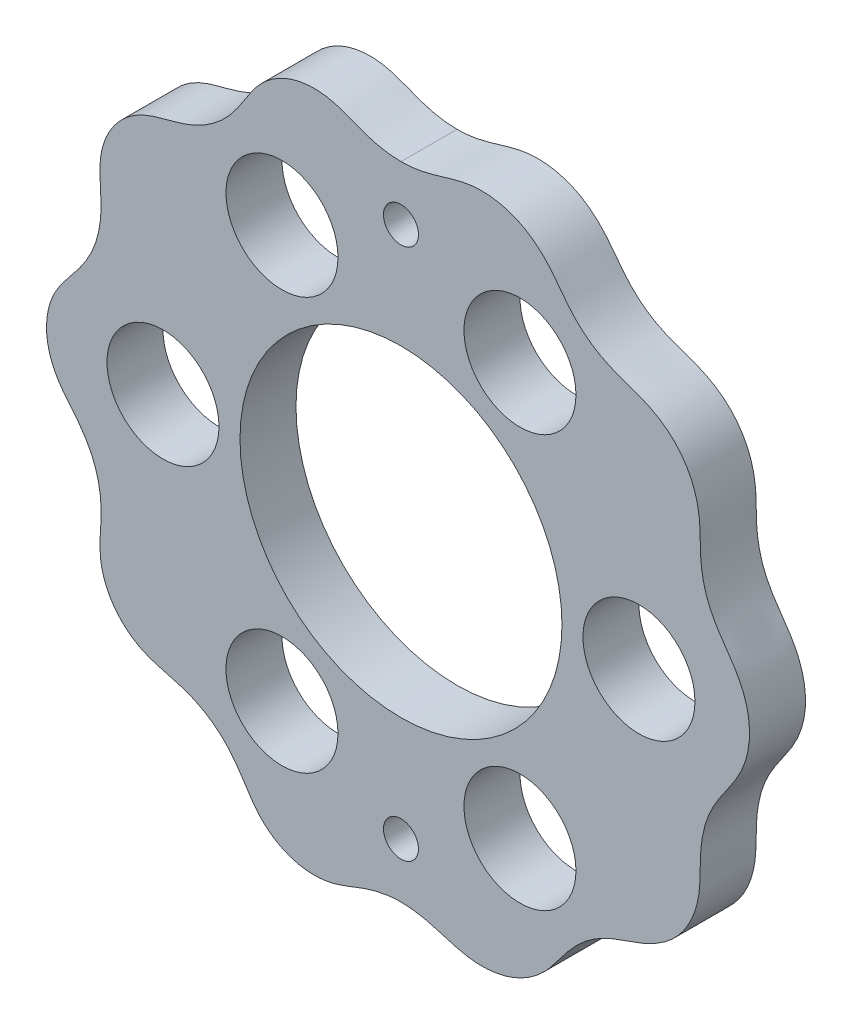
ISO-10303-21;
HEADER;
FILE_DESCRIPTION(('STEP AP214'),'2;1');
FILE_NAME('part.step','',(''),(''),'','','');
FILE_SCHEMA(('AUTOMOTIVE_DESIGN { 1 0 10303 214 1 1 1 1 }'));
ENDSEC;
DATA;
#1=APPLICATION_CONTEXT('core data for automotive mechanical design processes');
#2=APPLICATION_PROTOCOL_DEFINITION('international standard','automotive_design',2000,#1);
#3=PRODUCT_CONTEXT('',#1,'mechanical');
#4=PRODUCT('Part','Part','',(#3));
#5=PRODUCT_RELATED_PRODUCT_CATEGORY('part','',(#4));
#6=PRODUCT_DEFINITION_FORMATION('','',#4);
#7=PRODUCT_DEFINITION_CONTEXT('part definition',#1,'design');
#8=PRODUCT_DEFINITION('design','',#6,#7);
#9=PRODUCT_DEFINITION_SHAPE('','',#8);
#10=(LENGTH_UNIT() NAMED_UNIT(*) SI_UNIT(.MILLI.,.METRE.));
#11=(NAMED_UNIT(*) PLANE_ANGLE_UNIT() SI_UNIT($,.RADIAN.));
#12=(NAMED_UNIT(*) SI_UNIT($,.STERADIAN.) SOLID_ANGLE_UNIT());
#13=UNCERTAINTY_MEASURE_WITH_UNIT(LENGTH_MEASURE(1.E-05),#10,'distance_accuracy_value','');
#14=(GEOMETRIC_REPRESENTATION_CONTEXT(3) GLOBAL_UNCERTAINTY_ASSIGNED_CONTEXT((#13)) GLOBAL_UNIT_ASSIGNED_CONTEXT((#10,
#11,#12)) REPRESENTATION_CONTEXT('',''));
#15=CARTESIAN_POINT('',(0.,0.,0.));
#16=DIRECTION('',(0.,0.,1.));
#17=DIRECTION('',(1.,0.,0.));
#18=AXIS2_PLACEMENT_3D('',#15,#16,#17);
#19=CARTESIAN_POINT('',(0.,0.,4.));
#20=DIRECTION('',(0.,0.,1.));
#21=DIRECTION('',(1.,0.,0.));
#22=AXIS2_PLACEMENT_3D('',#19,#20,#21);
#23=PLANE('',#22);
#24=CARTESIAN_POINT('',(6.80687385689952E-08,22.9,4.));
#25=CARTESIAN_POINT('',(-0.849848245575323,22.899999421519,4.));
#26=CARTESIAN_POINT('',(-2.55799703086719,23.234494518274,4.));
#27=CARTESIAN_POINT('',(-4.84209897320977,24.3571470029628,4.));
#28=CARTESIAN_POINT('',(-7.38824943289522,24.4090318004474,4.));
#29=CARTESIAN_POINT('',(-9.2989625766548,23.4707300033717,4.));
#30=CARTESIAN_POINT('',(-10.4476099129223,22.2655269655052,4.));
#31=CARTESIAN_POINT('',(-11.1222996599059,21.2067402829562,4.));
#32=CARTESIAN_POINT('',(-11.8109485603763,20.1346897958365,4.));
#33=CARTESIAN_POINT('',(-12.9292093113298,18.8343042134774,4.));
#34=CARTESIAN_POINT('',(-14.3734940678994,17.867994898642,4.));
#35=CARTESIAN_POINT('',(-15.9902055685397,17.3091603310618,4.));
#36=CARTESIAN_POINT('',(-17.2240962787875,17.0202874716661,4.));
#37=CARTESIAN_POINT('',(-18.4122599863667,16.6333152815989,4.));
#38=CARTESIAN_POINT('',(-19.8401974179204,15.7732146910942,4.));
#39=CARTESIAN_POINT('',(-20.9023859706389,14.4467282823421,4.));
#40=CARTESIAN_POINT('',(-21.4305941193407,12.8657609067849,4.));
#41=CARTESIAN_POINT('',(-21.5384396494871,11.6220858465061,4.));
#42=CARTESIAN_POINT('',(-21.4395578627306,10.3668669478771,4.));
#43=CARTESIAN_POINT('',(-21.3781665530133,8.66414807055586,4.));
#44=CARTESIAN_POINT('',(-21.719833588447,6.96081431446029,4.));
#45=CARTESIAN_POINT('',(-22.5115323811958,5.43696216553692,4.));
#46=CARTESIAN_POINT('',(-23.2720433261361,4.40765566357071,4.));
#47=CARTESIAN_POINT('',(-24.1010226117925,3.45382079272216,4.));
#48=CARTESIAN_POINT('',(-25.0222606755398,2.0670338402279,4.));
#49=CARTESIAN_POINT('',(-25.5201681250728,-5.11647539657226E-08,4.));
#50=CARTESIAN_POINT('',(-25.022260643646,-2.06703393448226,4.));
#51=CARTESIAN_POINT('',(-24.1010225605347,-3.45382087422553,4.));
#52=CARTESIAN_POINT('',(-23.2720432731089,-4.40765574556851,4.));
#53=CARTESIAN_POINT('',(-22.5115323370295,-5.436962254891,4.));
#54=CARTESIAN_POINT('',(-21.7198335615532,-6.96081441318514,4.));
#55=CARTESIAN_POINT('',(-21.3781665475565,-8.66414817326333,4.));
#56=CARTESIAN_POINT('',(-21.43955787087,-10.366867048911,4.));
#57=CARTESIAN_POINT('',(-21.5384396524126,-11.6220859465092,4.));
#58=CARTESIAN_POINT('',(-21.4305941038811,-12.8657610053165,4.));
#59=CARTESIAN_POINT('',(-20.9023859310896,-14.4467283727275,4.));
#60=CARTESIAN_POINT('',(-19.8401973582201,-15.7732147654789,4.));
#61=CARTESIAN_POINT('',(-18.4122599136518,-16.6333153340259,4.));
#62=CARTESIAN_POINT('',(-17.2240962007482,-17.0202875096316,4.));
#63=CARTESIAN_POINT('',(-15.990205489842,-17.3091603719216,4.));
#64=CARTESIAN_POINT('',(-14.3734939938859,-17.8679949555753,4.));
#65=CARTESIAN_POINT('',(-12.9292092491784,-18.8343042887868,4.));
#66=CARTESIAN_POINT('',(-11.8109485132322,-20.1346898826596,4.));
#67=CARTESIAN_POINT('',(-11.1222996193085,-21.206740373664,4.));
#68=CARTESIAN_POINT('',(-10.4476098666809,-22.2655270497212,4.));
#69=CARTESIAN_POINT('',(-9.29896251077115,-23.470730072071,4.));
#70=CARTESIAN_POINT('',(-7.38824935040255,-24.4090318289951,4.));
#71=CARTESIAN_POINT('',(-4.84209890282732,-24.357147038307,4.));
#72=CARTESIAN_POINT('',(-2.55799696718396,-23.2344943482924,4.));
#73=CARTESIAN_POINT('',(-0.84984825840374,-22.8999997768332,4.));
#74=CARTESIAN_POINT('',(2.62595970309247E-08,-22.9,4.));
#75=B_SPLINE_CURVE_WITH_KNOTS('',3,(#24,#25,#26,#27,#28,#29,#30,#31,#32,#33,#34,#35,#36,#37,#38,
#39,#40,#41,#42,#43,#44,#45,#46,#47,#48,#49,#50,#51,#52,#53,#54,#55,#56,#57,#58,#59,#60,#61,#62,
#63,#64,#65,#66,#67,#68,#69,#70,#71,#72,#73,#74),.UNSPECIFIED.,.F.,.F.,(4,1,1,1,1,1,1,1,1,1,1,1,
1,1,1,1,1,1,1,1,1,1,1,1,1,1,1,1,1,1,1,1,1,1,1,1,1,1,1,1,1,1,1,1,1,1,1,1,4),(0.117046027877187,
0.140980651159151,0.164915274441115,0.18884989772308,0.212784521005044,0.224751832646026,
0.236719144287008,0.24868645592799,0.260653767568972,0.284588390850936,0.296555702491918,
0.308523014132901,0.320490325773883,0.332457637414865,0.356392260696829,0.368359572337811,
0.380326883978793,0.392294195619775,0.404261507260757,0.428196130542722,0.440163442183704,
0.452130753824686,0.464098065465668,0.47606537710665,0.500000000388614,0.523934623670578,
0.535901935311561,0.547869246952543,0.559836558593525,0.571803870234507,0.595738493516471,
0.607705805157453,0.619673116798435,0.631640428439417,0.6436077400804,0.667542363362364,
0.679509675003346,0.691476986644328,0.70344429828531,0.715411609926292,0.739346233208256,
0.751313544849239,0.763280856490221,0.775248168131203,0.787215479772185,0.811150103054149,
0.835084726336113,0.859019349618078,0.882953972900042),.UNSPECIFIED.);
#76=CARTESIAN_POINT('',(6.80687385689952E-08,22.9,4.));
#77=VERTEX_POINT('',#76);
#78=CARTESIAN_POINT('',(2.62595970309247E-08,-22.9,4.));
#79=VERTEX_POINT('',#78);
#80=EDGE_CURVE('E97',#77,#79,#75,.T.);
#81=ORIENTED_EDGE('',*,*,#80,.T.);
#82=CARTESIAN_POINT('',(5.31353240498593E-09,-22.9,4.));
#83=CARTESIAN_POINT('',(0.0479343585598001,-22.900000002547,4.));
#84=CARTESIAN_POINT('',(0.13714540575154,-22.9011308501469,4.));
#85=CARTESIAN_POINT('',(0.368749393491954,-22.9078600885241,4.));
#86=CARTESIAN_POINT('',(0.7258436938042,-22.9315159303343,4.));
#87=CARTESIAN_POINT('',(1.45197708305283,-23.0238640917879,4.));
#88=CARTESIAN_POINT('',(2.85881647932533,-23.3796671357368,4.));
#89=CARTESIAN_POINT('',(4.79500129898774,-24.0592741902231,4.));
#90=CARTESIAN_POINT('',(7.26652612572946,-23.9714200708544,4.));
#91=CARTESIAN_POINT('',(9.13379946599236,-23.1044291129207,4.));
#92=CARTESIAN_POINT('',(10.3487078465888,-22.026006284772,4.));
#93=CARTESIAN_POINT('',(11.1162199221863,-21.0766626305007,4.));
#94=CARTESIAN_POINT('',(11.8424547815371,-20.0777989172333,4.));
#95=CARTESIAN_POINT('',(12.9451693660676,-18.8298399812805,4.));
#96=CARTESIAN_POINT('',(14.7037731564629,-17.6464133067808,4.));
#97=CARTESIAN_POINT('',(17.1041894013219,-16.9912839151471,4.));
#98=CARTESIAN_POINT('',(19.2623770366255,-15.8325860053224,4.));
#99=CARTESIAN_POINT('',(20.7982420575441,-13.8797598658042,4.));
#100=CARTESIAN_POINT('',(21.4446430618977,-11.5063170899898,4.));
#101=CARTESIAN_POINT('',(21.3116991357865,-9.0354079873425,4.));
#102=CARTESIAN_POINT('',(21.7239604741078,-6.96534161970375,4.));
#103=CARTESIAN_POINT('',(22.4839442321817,-5.47673873507363,4.));
#104=CARTESIAN_POINT('',(23.1876157080151,-4.45481945445358,4.));
#105=CARTESIAN_POINT('',(23.8965939922914,-3.45502657702556,4.));
#106=CARTESIAN_POINT('',(24.6531583752307,-2.0176295325535,4.));
#107=CARTESIAN_POINT('',(25.0645413675173,1.80752103822596E-08,4.));
#108=CARTESIAN_POINT('',(24.6531583168596,2.01762955617961,4.));
#109=CARTESIAN_POINT('',(23.8965938988399,3.45502658242357,4.));
#110=CARTESIAN_POINT('',(23.1876156078321,4.45481945828779,4.));
#111=CARTESIAN_POINT('',(22.4839441552806,5.47673875798975,4.));
#112=CARTESIAN_POINT('',(21.7239604510099,6.9653416727004,4.));
#113=CARTESIAN_POINT('',(21.3116992066363,9.03540805409759,4.));
#114=CARTESIAN_POINT('',(21.4446431406711,11.5063171497609,4.));
#115=CARTESIAN_POINT('',(20.7982420582875,13.8797599104486,4.));
#116=CARTESIAN_POINT('',(19.2623769854702,15.8325860059975,4.));
#117=CARTESIAN_POINT('',(17.1041893119356,16.9912838532253,4.));
#118=CARTESIAN_POINT('',(14.7037730830333,17.6464132691495,4.));
#119=CARTESIAN_POINT('',(12.9451693059984,18.8298400898382,4.));
#120=CARTESIAN_POINT('',(11.8424548341906,20.0777989384244,4.));
#121=CARTESIAN_POINT('',(11.1162198883396,21.076662834959,4.));
#122=CARTESIAN_POINT('',(10.3487079355046,22.0260062698571,4.));
#123=CARTESIAN_POINT('',(9.13379937523994,23.1044291074096,4.));
#124=CARTESIAN_POINT('',(7.26652635092096,23.9714215043001,4.));
#125=CARTESIAN_POINT('',(4.794999873116,24.0592680368879,4.));
#126=CARTESIAN_POINT('',(2.85881854857043,23.3796951220122,4.));
#127=CARTESIAN_POINT('',(1.45197327321641,23.0238616664672,4.));
#128=CARTESIAN_POINT('',(0.725843931299967,22.9315165424164,4.));
#129=CARTESIAN_POINT('',(0.368749239641922,22.907859959244,4.));
#130=CARTESIAN_POINT('',(0.137144866100526,22.9011308613516,4.));
#131=CARTESIAN_POINT('',(0.0479342263871348,22.9000000008991,4.));
#132=CARTESIAN_POINT('',(1.87557195246204E-09,22.9,4.));
#133=B_SPLINE_CURVE_WITH_KNOTS('',3,(#82,#83,#84,#85,#86,#87,#88,#89,#90,#91,#92,#93,#94,#95,
#96,#97,#98,#99,#100,#101,#102,#103,#104,#105,#106,#107,#108,#109,#110,#111,#112,#113,#114,#115,
#116,#117,#118,#119,#120,#121,#122,#123,#124,#125,#126,#127,#128,#129,#130,#131,#132),
.UNSPECIFIED.,.F.,.F.,(4,1,1,1,1,1,1,1,1,1,1,1,1,1,1,1,1,1,1,1,1,1,1,1,1,1,1,1,1,1,1,1,1,1,1,1,
1,1,1,1,1,1,1,1,1,1,1,1,4),(0.0776965161924603,0.0793461391741359,0.0809957621558114,
0.0842950081191625,0.0908935000458646,0.104090483899269,0.130484451606077,0.156878419312886,
0.183272387019694,0.196469370873098,0.209666354726503,0.222863338579907,0.236060322433311,
0.262454290140119,0.288848257846928,0.315242225553736,0.341636193260545,0.368030160967353,
0.394424128674161,0.42081809638097,0.434015080234374,0.447212064087778,0.460409047941183,
0.473606031794587,0.499999999501395,0.526393967208204,0.539590951061608,0.552787934915012,
0.565984918768416,0.57918190262182,0.605575870328629,0.631969838035437,0.658363805742246,
0.684757773449054,0.711151741155863,0.737545708862671,0.763939676569479,0.777136660422884,
0.790333644276288,0.803530628129692,0.816727611983096,0.843121579689905,0.869515547396713,
0.895909515103522,0.909106498956926,0.915704990883628,0.919004236846979,0.920653859828654,
0.92230348281033),.UNSPECIFIED.);
#134=EDGE_CURVE('E83',#79,#77,#133,.T.);
#135=ORIENTED_EDGE('',*,*,#134,.T.);
#136=EDGE_LOOP('',(#81,#135));
#137=FACE_BOUND('',#136,.T.);
#138=CARTESIAN_POINT('',(8.5,14.7224318643355,4.));
#139=DIRECTION('',(0.,0.,1.));
#140=DIRECTION('',(1.,0.,0.));
#141=AXIS2_PLACEMENT_3D('',#138,#139,#140);
#142=CIRCLE('',#141,4.);
#143=CARTESIAN_POINT('',(12.5,14.7224318643355,4.));
#144=VERTEX_POINT('',#143);
#145=EDGE_CURVE('E107',#144,#144,#142,.T.);
#146=ORIENTED_EDGE('',*,*,#145,.F.);
#147=EDGE_LOOP('',(#146));
#148=FACE_BOUND('',#147,.T.);
#149=CARTESIAN_POINT('',(-8.50000000000001,14.7224318643355,4.));
#150=DIRECTION('',(0.,0.,1.));
#151=DIRECTION('',(1.,0.,0.));
#152=AXIS2_PLACEMENT_3D('',#149,#150,#151);
#153=CIRCLE('',#152,4.);
#154=CARTESIAN_POINT('',(-4.50000000000001,14.7224318643355,4.));
#155=VERTEX_POINT('',#154);
#156=EDGE_CURVE('E199',#155,#155,#153,.T.);
#157=ORIENTED_EDGE('',*,*,#156,.F.);
#158=EDGE_LOOP('',(#157));
#159=FACE_BOUND('',#158,.T.);
#160=CARTESIAN_POINT('',(17.,0.,4.));
#161=DIRECTION('',(0.,0.,1.));
#162=DIRECTION('',(1.,0.,0.));
#163=AXIS2_PLACEMENT_3D('',#160,#161,#162);
#164=CIRCLE('',#163,4.);
#165=CARTESIAN_POINT('',(21.,0.,4.));
#166=VERTEX_POINT('',#165);
#167=EDGE_CURVE('E192',#166,#166,#164,.T.);
#168=ORIENTED_EDGE('',*,*,#167,.F.);
#169=EDGE_LOOP('',(#168));
#170=FACE_BOUND('',#169,.T.);
#171=CARTESIAN_POINT('',(0.,0.,4.));
#172=DIRECTION('',(0.,0.,1.));
#173=DIRECTION('',(1.,0.,0.));
#174=AXIS2_PLACEMENT_3D('',#171,#172,#173);
#175=CIRCLE('',#174,11.5);
#176=CARTESIAN_POINT('',(11.5,0.,4.));
#177=VERTEX_POINT('',#176);
#178=EDGE_CURVE('E220',#177,#177,#175,.T.);
#179=ORIENTED_EDGE('',*,*,#178,.F.);
#180=EDGE_LOOP('',(#179));
#181=FACE_BOUND('',#180,.T.);
#182=CARTESIAN_POINT('',(-17.,0.,4.));
#183=DIRECTION('',(0.,0.,1.));
#184=DIRECTION('',(1.,0.,0.));
#185=AXIS2_PLACEMENT_3D('',#182,#183,#184);
#186=CIRCLE('',#185,4.);
#187=CARTESIAN_POINT('',(-13.,0.,4.));
#188=VERTEX_POINT('',#187);
#189=EDGE_CURVE('E224',#188,#188,#186,.T.);
#190=ORIENTED_EDGE('',*,*,#189,.F.);
#191=EDGE_LOOP('',(#190));
#192=FACE_BOUND('',#191,.T.);
#193=CARTESIAN_POINT('',(-8.5,-14.7224318643355,4.));
#194=DIRECTION('',(0.,0.,1.));
#195=DIRECTION('',(1.,0.,0.));
#196=AXIS2_PLACEMENT_3D('',#193,#194,#195);
#197=CIRCLE('',#196,4.);
#198=CARTESIAN_POINT('',(-4.5,-14.7224318643355,4.));
#199=VERTEX_POINT('',#198);
#200=EDGE_CURVE('E202',#199,#199,#197,.T.);
#201=ORIENTED_EDGE('',*,*,#200,.F.);
#202=EDGE_LOOP('',(#201));
#203=FACE_BOUND('',#202,.T.);
#204=CARTESIAN_POINT('',(8.5,-14.7224318643355,4.));
#205=DIRECTION('',(0.,0.,1.));
#206=DIRECTION('',(1.,0.,0.));
#207=AXIS2_PLACEMENT_3D('',#204,#205,#206);
#208=CIRCLE('',#207,4.);
#209=CARTESIAN_POINT('',(12.5,-14.7224318643355,4.));
#210=VERTEX_POINT('',#209);
#211=EDGE_CURVE('E215',#210,#210,#208,.T.);
#212=ORIENTED_EDGE('',*,*,#211,.F.);
#213=EDGE_LOOP('',(#212));
#214=FACE_BOUND('',#213,.T.);
#215=CARTESIAN_POINT('',(0.,19.,4.));
#216=DIRECTION('',(0.,0.,1.));
#217=DIRECTION('',(1.,0.,0.));
#218=AXIS2_PLACEMENT_3D('',#215,#216,#217);
#219=CIRCLE('',#218,1.25);
#220=CARTESIAN_POINT('',(1.25,19.,4.));
#221=VERTEX_POINT('',#220);
#222=EDGE_CURVE('E181',#221,#221,#219,.T.);
#223=ORIENTED_EDGE('',*,*,#222,.F.);
#224=EDGE_LOOP('',(#223));
#225=FACE_BOUND('',#224,.T.);
#226=CARTESIAN_POINT('',(0.,-19.,4.));
#227=DIRECTION('',(0.,0.,1.));
#228=DIRECTION('',(1.,0.,0.));
#229=AXIS2_PLACEMENT_3D('',#226,#227,#228);
#230=CIRCLE('',#229,1.25);
#231=CARTESIAN_POINT('',(1.25,-19.,4.));
#232=VERTEX_POINT('',#231);
#233=EDGE_CURVE('E182',#232,#232,#230,.F.);
#234=ORIENTED_EDGE('',*,*,#233,.T.);
#235=EDGE_LOOP('',(#234));
#236=FACE_BOUND('',#235,.T.);
#237=ADVANCED_FACE('F70',(#137,#148,#159,#170,#181,#192,#203,#214,#225,#236),#23,.T.);
#238=CARTESIAN_POINT('',(0.,0.,0.));
#239=DIRECTION('',(0.,0.,1.));
#240=DIRECTION('',(1.,0.,0.));
#241=AXIS2_PLACEMENT_3D('',#238,#239,#240);
#242=PLANE('',#241);
#243=CARTESIAN_POINT('',(0.,19.,0.));
#244=DIRECTION('',(0.,0.,1.));
#245=DIRECTION('',(1.,0.,0.));
#246=AXIS2_PLACEMENT_3D('',#243,#244,#245);
#247=CIRCLE('',#246,1.25);
#248=CARTESIAN_POINT('',(1.25,19.,0.));
#249=VERTEX_POINT('',#248);
#250=EDGE_CURVE('E188',#249,#249,#247,.T.);
#251=ORIENTED_EDGE('',*,*,#250,.T.);
#252=EDGE_LOOP('',(#251));
#253=FACE_BOUND('',#252,.T.);
#254=CARTESIAN_POINT('',(8.5,-14.7224318643355,0.));
#255=DIRECTION('',(0.,0.,1.));
#256=DIRECTION('',(1.,0.,0.));
#257=AXIS2_PLACEMENT_3D('',#254,#255,#256);
#258=CIRCLE('',#257,4.);
#259=CARTESIAN_POINT('',(12.5,-14.7224318643355,0.));
#260=VERTEX_POINT('',#259);
#261=EDGE_CURVE('E198',#260,#260,#258,.T.);
#262=ORIENTED_EDGE('',*,*,#261,.T.);
#263=EDGE_LOOP('',(#262));
#264=FACE_BOUND('',#263,.T.);
#265=CARTESIAN_POINT('',(-8.5,-14.7224318643355,0.));
#266=DIRECTION('',(0.,0.,1.));
#267=DIRECTION('',(1.,0.,0.));
#268=AXIS2_PLACEMENT_3D('',#265,#266,#267);
#269=CIRCLE('',#268,4.);
#270=CARTESIAN_POINT('',(-4.5,-14.7224318643355,0.));
#271=VERTEX_POINT('',#270);
#272=EDGE_CURVE('E207',#271,#271,#269,.T.);
#273=ORIENTED_EDGE('',*,*,#272,.T.);
#274=EDGE_LOOP('',(#273));
#275=FACE_BOUND('',#274,.T.);
#276=CARTESIAN_POINT('',(-17.,0.,0.));
#277=DIRECTION('',(0.,0.,1.));
#278=DIRECTION('',(1.,0.,0.));
#279=AXIS2_PLACEMENT_3D('',#276,#277,#278);
#280=CIRCLE('',#279,4.);
#281=CARTESIAN_POINT('',(-13.,0.,0.));
#282=VERTEX_POINT('',#281);
#283=EDGE_CURVE('E208',#282,#282,#280,.T.);
#284=ORIENTED_EDGE('',*,*,#283,.T.);
#285=EDGE_LOOP('',(#284));
#286=FACE_BOUND('',#285,.T.);
#287=CARTESIAN_POINT('',(0.,0.,0.));
#288=DIRECTION('',(0.,0.,1.));
#289=DIRECTION('',(1.,0.,0.));
#290=AXIS2_PLACEMENT_3D('',#287,#288,#289);
#291=CIRCLE('',#290,11.5);
#292=CARTESIAN_POINT('',(11.5,0.,0.));
#293=VERTEX_POINT('',#292);
#294=EDGE_CURVE('E219',#293,#293,#291,.T.);
#295=ORIENTED_EDGE('',*,*,#294,.T.);
#296=EDGE_LOOP('',(#295));
#297=FACE_BOUND('',#296,.T.);
#298=CARTESIAN_POINT('',(17.,0.,0.));
#299=DIRECTION('',(0.,0.,1.));
#300=DIRECTION('',(1.,0.,0.));
#301=AXIS2_PLACEMENT_3D('',#298,#299,#300);
#302=CIRCLE('',#301,4.);
#303=CARTESIAN_POINT('',(21.,0.,0.));
#304=VERTEX_POINT('',#303);
#305=EDGE_CURVE('E197',#304,#304,#302,.T.);
#306=ORIENTED_EDGE('',*,*,#305,.T.);
#307=EDGE_LOOP('',(#306));
#308=FACE_BOUND('',#307,.T.);
#309=CARTESIAN_POINT('',(-8.50000000000001,14.7224318643355,0.));
#310=DIRECTION('',(0.,0.,1.));
#311=DIRECTION('',(1.,0.,0.));
#312=AXIS2_PLACEMENT_3D('',#309,#310,#311);
#313=CIRCLE('',#312,4.);
#314=CARTESIAN_POINT('',(-4.50000000000001,14.7224318643355,0.));
#315=VERTEX_POINT('',#314);
#316=EDGE_CURVE('E183',#315,#315,#313,.T.);
#317=ORIENTED_EDGE('',*,*,#316,.T.);
#318=EDGE_LOOP('',(#317));
#319=FACE_BOUND('',#318,.T.);
#320=CARTESIAN_POINT('',(8.5,14.7224318643355,0.));
#321=DIRECTION('',(0.,0.,1.));
#322=DIRECTION('',(1.,0.,0.));
#323=AXIS2_PLACEMENT_3D('',#320,#321,#322);
#324=CIRCLE('',#323,4.);
#325=CARTESIAN_POINT('',(12.5,14.7224318643355,0.));
#326=VERTEX_POINT('',#325);
#327=EDGE_CURVE('E104',#326,#326,#324,.T.);
#328=ORIENTED_EDGE('',*,*,#327,.T.);
#329=EDGE_LOOP('',(#328));
#330=FACE_BOUND('',#329,.T.);
#331=CARTESIAN_POINT('',(6.80687385689952E-08,22.9,0.));
#332=CARTESIAN_POINT('',(-0.849848245575323,22.899999421519,0.));
#333=CARTESIAN_POINT('',(-2.55799703086719,23.234494518274,0.));
#334=CARTESIAN_POINT('',(-4.84209897320977,24.3571470029628,0.));
#335=CARTESIAN_POINT('',(-7.38824943289522,24.4090318004474,0.));
#336=CARTESIAN_POINT('',(-9.2989625766548,23.4707300033717,0.));
#337=CARTESIAN_POINT('',(-10.4476099129223,22.2655269655052,0.));
#338=CARTESIAN_POINT('',(-11.1222996599059,21.2067402829562,0.));
#339=CARTESIAN_POINT('',(-11.8109485603763,20.1346897958365,0.));
#340=CARTESIAN_POINT('',(-12.9292093113298,18.8343042134774,0.));
#341=CARTESIAN_POINT('',(-14.3734940678994,17.867994898642,0.));
#342=CARTESIAN_POINT('',(-15.9902055685397,17.3091603310618,0.));
#343=CARTESIAN_POINT('',(-17.2240962787875,17.0202874716661,0.));
#344=CARTESIAN_POINT('',(-18.4122599863667,16.6333152815989,0.));
#345=CARTESIAN_POINT('',(-19.8401974179204,15.7732146910942,0.));
#346=CARTESIAN_POINT('',(-20.9023859706389,14.4467282823421,0.));
#347=CARTESIAN_POINT('',(-21.4305941193407,12.8657609067849,0.));
#348=CARTESIAN_POINT('',(-21.5384396494871,11.6220858465061,0.));
#349=CARTESIAN_POINT('',(-21.4395578627306,10.3668669478771,0.));
#350=CARTESIAN_POINT('',(-21.3781665530133,8.66414807055586,0.));
#351=CARTESIAN_POINT('',(-21.719833588447,6.96081431446029,0.));
#352=CARTESIAN_POINT('',(-22.5115323811958,5.43696216553692,0.));
#353=CARTESIAN_POINT('',(-23.2720433261361,4.40765566357071,0.));
#354=CARTESIAN_POINT('',(-24.1010226117925,3.45382079272216,0.));
#355=CARTESIAN_POINT('',(-25.0222606755398,2.0670338402279,0.));
#356=CARTESIAN_POINT('',(-25.5201681250728,-5.11647539657226E-08,0.));
#357=CARTESIAN_POINT('',(-25.022260643646,-2.06703393448226,0.));
#358=CARTESIAN_POINT('',(-24.1010225605347,-3.45382087422553,0.));
#359=CARTESIAN_POINT('',(-23.2720432731089,-4.40765574556851,0.));
#360=CARTESIAN_POINT('',(-22.5115323370295,-5.436962254891,0.));
#361=CARTESIAN_POINT('',(-21.7198335615532,-6.96081441318514,0.));
#362=CARTESIAN_POINT('',(-21.3781665475565,-8.66414817326333,0.));
#363=CARTESIAN_POINT('',(-21.43955787087,-10.366867048911,0.));
#364=CARTESIAN_POINT('',(-21.5384396524126,-11.6220859465092,0.));
#365=CARTESIAN_POINT('',(-21.4305941038811,-12.8657610053165,0.));
#366=CARTESIAN_POINT('',(-20.9023859310896,-14.4467283727275,0.));
#367=CARTESIAN_POINT('',(-19.8401973582201,-15.7732147654789,0.));
#368=CARTESIAN_POINT('',(-18.4122599136518,-16.6333153340259,0.));
#369=CARTESIAN_POINT('',(-17.2240962007482,-17.0202875096316,0.));
#370=CARTESIAN_POINT('',(-15.990205489842,-17.3091603719216,0.));
#371=CARTESIAN_POINT('',(-14.3734939938859,-17.8679949555753,0.));
#372=CARTESIAN_POINT('',(-12.9292092491784,-18.8343042887868,0.));
#373=CARTESIAN_POINT('',(-11.8109485132322,-20.1346898826596,0.));
#374=CARTESIAN_POINT('',(-11.1222996193085,-21.206740373664,0.));
#375=CARTESIAN_POINT('',(-10.4476098666809,-22.2655270497212,0.));
#376=CARTESIAN_POINT('',(-9.29896251077115,-23.470730072071,0.));
#377=CARTESIAN_POINT('',(-7.38824935040255,-24.4090318289951,0.));
#378=CARTESIAN_POINT('',(-4.84209890282732,-24.357147038307,0.));
#379=CARTESIAN_POINT('',(-2.55799696718396,-23.2344943482924,0.));
#380=CARTESIAN_POINT('',(-0.84984825840374,-22.8999997768332,0.));
#381=CARTESIAN_POINT('',(2.62595970309247E-08,-22.9,0.));
#382=B_SPLINE_CURVE_WITH_KNOTS('',3,(#331,#332,#333,#334,#335,#336,#337,#338,#339,#340,#341,
#342,#343,#344,#345,#346,#347,#348,#349,#350,#351,#352,#353,#354,#355,#356,#357,#358,#359,#360,
#361,#362,#363,#364,#365,#366,#367,#368,#369,#370,#371,#372,#373,#374,#375,#376,#377,#378,#379,
#380,#381),.UNSPECIFIED.,.F.,.F.,(4,1,1,1,1,1,1,1,1,1,1,1,1,1,1,1,1,1,1,1,1,1,1,1,1,1,1,1,1,1,1,
1,1,1,1,1,1,1,1,1,1,1,1,1,1,1,1,1,4),(0.117046027877187,0.140980651159151,0.164915274441115,
0.18884989772308,0.212784521005044,0.224751832646026,0.236719144287008,0.24868645592799,
0.260653767568972,0.284588390850936,0.296555702491918,0.308523014132901,0.320490325773883,
0.332457637414865,0.356392260696829,0.368359572337811,0.380326883978793,0.392294195619775,
0.404261507260757,0.428196130542722,0.440163442183704,0.452130753824686,0.464098065465668,
0.47606537710665,0.500000000388614,0.523934623670578,0.535901935311561,0.547869246952543,
0.559836558593525,0.571803870234507,0.595738493516471,0.607705805157453,0.619673116798435,
0.631640428439417,0.6436077400804,0.667542363362364,0.679509675003346,0.691476986644328,
0.70344429828531,0.715411609926292,0.739346233208256,0.751313544849239,0.763280856490221,
0.775248168131203,0.787215479772185,0.811150103054149,0.835084726336113,0.859019349618078,
0.882953972900042),.UNSPECIFIED.);
#383=CARTESIAN_POINT('',(6.80687385689952E-08,22.9,0.));
#384=VERTEX_POINT('',#383);
#385=CARTESIAN_POINT('',(2.62595970309247E-08,-22.9,0.));
#386=VERTEX_POINT('',#385);
#387=EDGE_CURVE('E99',#384,#386,#382,.T.);
#388=ORIENTED_EDGE('',*,*,#387,.F.);
#389=CARTESIAN_POINT('',(5.31353240498593E-09,-22.9,0.));
#390=CARTESIAN_POINT('',(0.0479343585598001,-22.900000002547,0.));
#391=CARTESIAN_POINT('',(0.13714540575154,-22.9011308501469,0.));
#392=CARTESIAN_POINT('',(0.368749393491954,-22.9078600885241,0.));
#393=CARTESIAN_POINT('',(0.7258436938042,-22.9315159303343,0.));
#394=CARTESIAN_POINT('',(1.45197708305283,-23.0238640917879,0.));
#395=CARTESIAN_POINT('',(2.85881647932533,-23.3796671357368,0.));
#396=CARTESIAN_POINT('',(4.79500129898774,-24.0592741902231,0.));
#397=CARTESIAN_POINT('',(7.26652612572946,-23.9714200708544,0.));
#398=CARTESIAN_POINT('',(9.13379946599236,-23.1044291129207,0.));
#399=CARTESIAN_POINT('',(10.3487078465888,-22.026006284772,0.));
#400=CARTESIAN_POINT('',(11.1162199221863,-21.0766626305007,0.));
#401=CARTESIAN_POINT('',(11.8424547815371,-20.0777989172333,0.));
#402=CARTESIAN_POINT('',(12.9451693660676,-18.8298399812805,0.));
#403=CARTESIAN_POINT('',(14.7037731564629,-17.6464133067808,0.));
#404=CARTESIAN_POINT('',(17.1041894013219,-16.9912839151471,0.));
#405=CARTESIAN_POINT('',(19.2623770366255,-15.8325860053224,0.));
#406=CARTESIAN_POINT('',(20.7982420575441,-13.8797598658042,0.));
#407=CARTESIAN_POINT('',(21.4446430618977,-11.5063170899898,0.));
#408=CARTESIAN_POINT('',(21.3116991357865,-9.0354079873425,0.));
#409=CARTESIAN_POINT('',(21.7239604741078,-6.96534161970375,0.));
#410=CARTESIAN_POINT('',(22.4839442321817,-5.47673873507363,0.));
#411=CARTESIAN_POINT('',(23.1876157080151,-4.45481945445358,0.));
#412=CARTESIAN_POINT('',(23.8965939922914,-3.45502657702556,0.));
#413=CARTESIAN_POINT('',(24.6531583752307,-2.0176295325535,0.));
#414=CARTESIAN_POINT('',(25.0645413675173,1.80752103822596E-08,0.));
#415=CARTESIAN_POINT('',(24.6531583168596,2.01762955617961,0.));
#416=CARTESIAN_POINT('',(23.8965938988399,3.45502658242357,0.));
#417=CARTESIAN_POINT('',(23.1876156078321,4.45481945828779,0.));
#418=CARTESIAN_POINT('',(22.4839441552806,5.47673875798975,0.));
#419=CARTESIAN_POINT('',(21.7239604510099,6.9653416727004,0.));
#420=CARTESIAN_POINT('',(21.3116992066363,9.03540805409759,0.));
#421=CARTESIAN_POINT('',(21.4446431406711,11.5063171497609,0.));
#422=CARTESIAN_POINT('',(20.7982420582875,13.8797599104486,0.));
#423=CARTESIAN_POINT('',(19.2623769854702,15.8325860059975,0.));
#424=CARTESIAN_POINT('',(17.1041893119356,16.9912838532253,0.));
#425=CARTESIAN_POINT('',(14.7037730830333,17.6464132691495,0.));
#426=CARTESIAN_POINT('',(12.9451693059984,18.8298400898382,0.));
#427=CARTESIAN_POINT('',(11.8424548341906,20.0777989384244,0.));
#428=CARTESIAN_POINT('',(11.1162198883396,21.076662834959,0.));
#429=CARTESIAN_POINT('',(10.3487079355046,22.0260062698571,0.));
#430=CARTESIAN_POINT('',(9.13379937523994,23.1044291074096,0.));
#431=CARTESIAN_POINT('',(7.26652635092096,23.9714215043001,0.));
#432=CARTESIAN_POINT('',(4.794999873116,24.0592680368879,0.));
#433=CARTESIAN_POINT('',(2.85881854857043,23.3796951220122,0.));
#434=CARTESIAN_POINT('',(1.45197327321641,23.0238616664672,0.));
#435=CARTESIAN_POINT('',(0.725843931299967,22.9315165424164,0.));
#436=CARTESIAN_POINT('',(0.368749239641922,22.907859959244,0.));
#437=CARTESIAN_POINT('',(0.137144866100526,22.9011308613516,0.));
#438=CARTESIAN_POINT('',(0.0479342263871348,22.9000000008991,0.));
#439=CARTESIAN_POINT('',(1.87557195246204E-09,22.9,0.));
#440=B_SPLINE_CURVE_WITH_KNOTS('',3,(#389,#390,#391,#392,#393,#394,#395,#396,#397,#398,#399,
#400,#401,#402,#403,#404,#405,#406,#407,#408,#409,#410,#411,#412,#413,#414,#415,#416,#417,#418,
#419,#420,#421,#422,#423,#424,#425,#426,#427,#428,#429,#430,#431,#432,#433,#434,#435,#436,#437,
#438,#439),.UNSPECIFIED.,.F.,.F.,(4,1,1,1,1,1,1,1,1,1,1,1,1,1,1,1,1,1,1,1,1,1,1,1,1,1,1,1,1,1,1,
1,1,1,1,1,1,1,1,1,1,1,1,1,1,1,1,1,4),(0.0776965161924603,0.0793461391741359,0.0809957621558114,
0.0842950081191625,0.0908935000458646,0.104090483899269,0.130484451606077,0.156878419312886,
0.183272387019694,0.196469370873098,0.209666354726503,0.222863338579907,0.236060322433311,
0.262454290140119,0.288848257846928,0.315242225553736,0.341636193260545,0.368030160967353,
0.394424128674161,0.42081809638097,0.434015080234374,0.447212064087778,0.460409047941183,
0.473606031794587,0.499999999501395,0.526393967208204,0.539590951061608,0.552787934915012,
0.565984918768416,0.57918190262182,0.605575870328629,0.631969838035437,0.658363805742246,
0.684757773449054,0.711151741155863,0.737545708862671,0.763939676569479,0.777136660422884,
0.790333644276288,0.803530628129692,0.816727611983096,0.843121579689905,0.869515547396713,
0.895909515103522,0.909106498956926,0.915704990883628,0.919004236846979,0.920653859828654,
0.92230348281033),.UNSPECIFIED.);
#441=EDGE_CURVE('E95',#386,#384,#440,.T.);
#442=ORIENTED_EDGE('',*,*,#441,.F.);
#443=EDGE_LOOP('',(#388,#442));
#444=FACE_BOUND('',#443,.T.);
#445=CARTESIAN_POINT('',(0.,-19.,0.));
#446=DIRECTION('',(0.,0.,1.));
#447=DIRECTION('',(1.,0.,0.));
#448=AXIS2_PLACEMENT_3D('',#445,#446,#447);
#449=CIRCLE('',#448,1.25);
#450=CARTESIAN_POINT('',(1.25,-19.,0.));
#451=VERTEX_POINT('',#450);
#452=EDGE_CURVE('E177',#451,#451,#449,.F.);
#453=ORIENTED_EDGE('',*,*,#452,.F.);
#454=EDGE_LOOP('',(#453));
#455=FACE_BOUND('',#454,.T.);
#456=ADVANCED_FACE('F103',(#253,#264,#275,#286,#297,#308,#319,#330,#444,#455),#242,.F.);
#457=DIRECTION('',(0.,0.,-1.));
#458=VECTOR('',#457,1.);
#459=SURFACE_OF_LINEAR_EXTRUSION('',#75,#458);
#460=ORIENTED_EDGE('',*,*,#387,.T.);
#461=DIRECTION('',(0.,0.,-1.));
#462=VECTOR('',#461,1.);
#463=CARTESIAN_POINT('',(2.62595970309247E-08,-22.9,4.));
#464=LINE('',#463,#462);
#465=EDGE_CURVE('E12',#79,#386,#464,.T.);
#466=ORIENTED_EDGE('',*,*,#465,.F.);
#467=ORIENTED_EDGE('',*,*,#80,.F.);
#468=DIRECTION('',(0.,0.,-1.));
#469=VECTOR('',#468,1.);
#470=CARTESIAN_POINT('',(6.80687385689952E-08,22.9,4.));
#471=LINE('',#470,#469);
#472=EDGE_CURVE('E80',#77,#384,#471,.T.);
#473=ORIENTED_EDGE('',*,*,#472,.T.);
#474=EDGE_LOOP('',(#460,#466,#467,#473));
#475=FACE_BOUND('',#474,.T.);
#476=ADVANCED_FACE('F68',(#475),#459,.F.);
#477=DIRECTION('',(0.,0.,-1.));
#478=VECTOR('',#477,1.);
#479=SURFACE_OF_LINEAR_EXTRUSION('',#133,#478);
#480=ORIENTED_EDGE('',*,*,#441,.T.);
#481=ORIENTED_EDGE('',*,*,#472,.F.);
#482=ORIENTED_EDGE('',*,*,#134,.F.);
#483=ORIENTED_EDGE('',*,*,#465,.T.);
#484=EDGE_LOOP('',(#480,#481,#482,#483));
#485=FACE_BOUND('',#484,.T.);
#486=ADVANCED_FACE('F92',(#485),#479,.F.);
#487=CARTESIAN_POINT('',(8.5,14.7224318643355,0.));
#488=DIRECTION('',(0.,0.,1.));
#489=DIRECTION('',(1.,0.,0.));
#490=AXIS2_PLACEMENT_3D('',#487,#488,#489);
#491=CYLINDRICAL_SURFACE('',#490,4.);
#492=ORIENTED_EDGE('',*,*,#327,.F.);
#493=EDGE_LOOP('',(#492));
#494=FACE_BOUND('',#493,.T.);
#495=ORIENTED_EDGE('',*,*,#145,.T.);
#496=EDGE_LOOP('',(#495));
#497=FACE_BOUND('',#496,.T.);
#498=ADVANCED_FACE('F133',(#494,#497),#491,.F.);
#499=CARTESIAN_POINT('',(-8.50000000000001,14.7224318643355,0.));
#500=DIRECTION('',(0.,0.,1.));
#501=DIRECTION('',(1.,0.,0.));
#502=AXIS2_PLACEMENT_3D('',#499,#500,#501);
#503=CYLINDRICAL_SURFACE('',#502,4.);
#504=ORIENTED_EDGE('',*,*,#316,.F.);
#505=EDGE_LOOP('',(#504));
#506=FACE_BOUND('',#505,.T.);
#507=ORIENTED_EDGE('',*,*,#156,.T.);
#508=EDGE_LOOP('',(#507));
#509=FACE_BOUND('',#508,.T.);
#510=ADVANCED_FACE('F143',(#506,#509),#503,.F.);
#511=CARTESIAN_POINT('',(17.,0.,0.));
#512=DIRECTION('',(0.,0.,1.));
#513=DIRECTION('',(1.,0.,0.));
#514=AXIS2_PLACEMENT_3D('',#511,#512,#513);
#515=CYLINDRICAL_SURFACE('',#514,4.);
#516=ORIENTED_EDGE('',*,*,#305,.F.);
#517=EDGE_LOOP('',(#516));
#518=FACE_BOUND('',#517,.T.);
#519=ORIENTED_EDGE('',*,*,#167,.T.);
#520=EDGE_LOOP('',(#519));
#521=FACE_BOUND('',#520,.T.);
#522=ADVANCED_FACE('F151',(#518,#521),#515,.F.);
#523=CARTESIAN_POINT('',(0.,0.,0.));
#524=DIRECTION('',(0.,0.,1.));
#525=DIRECTION('',(1.,0.,0.));
#526=AXIS2_PLACEMENT_3D('',#523,#524,#525);
#527=CYLINDRICAL_SURFACE('',#526,11.5);
#528=ORIENTED_EDGE('',*,*,#294,.F.);
#529=EDGE_LOOP('',(#528));
#530=FACE_BOUND('',#529,.T.);
#531=ORIENTED_EDGE('',*,*,#178,.T.);
#532=EDGE_LOOP('',(#531));
#533=FACE_BOUND('',#532,.T.);
#534=ADVANCED_FACE('F150',(#530,#533),#527,.F.);
#535=CARTESIAN_POINT('',(-17.,0.,0.));
#536=DIRECTION('',(0.,0.,1.));
#537=DIRECTION('',(1.,0.,0.));
#538=AXIS2_PLACEMENT_3D('',#535,#536,#537);
#539=CYLINDRICAL_SURFACE('',#538,4.);
#540=ORIENTED_EDGE('',*,*,#283,.F.);
#541=EDGE_LOOP('',(#540));
#542=FACE_BOUND('',#541,.T.);
#543=ORIENTED_EDGE('',*,*,#189,.T.);
#544=EDGE_LOOP('',(#543));
#545=FACE_BOUND('',#544,.T.);
#546=ADVANCED_FACE('F141',(#542,#545),#539,.F.);
#547=CARTESIAN_POINT('',(-8.5,-14.7224318643355,0.));
#548=DIRECTION('',(0.,0.,1.));
#549=DIRECTION('',(1.,0.,0.));
#550=AXIS2_PLACEMENT_3D('',#547,#548,#549);
#551=CYLINDRICAL_SURFACE('',#550,4.);
#552=ORIENTED_EDGE('',*,*,#272,.F.);
#553=EDGE_LOOP('',(#552));
#554=FACE_BOUND('',#553,.T.);
#555=ORIENTED_EDGE('',*,*,#200,.T.);
#556=EDGE_LOOP('',(#555));
#557=FACE_BOUND('',#556,.T.);
#558=ADVANCED_FACE('F148',(#554,#557),#551,.F.);
#559=CARTESIAN_POINT('',(8.5,-14.7224318643355,0.));
#560=DIRECTION('',(0.,0.,1.));
#561=DIRECTION('',(1.,0.,0.));
#562=AXIS2_PLACEMENT_3D('',#559,#560,#561);
#563=CYLINDRICAL_SURFACE('',#562,4.);
#564=ORIENTED_EDGE('',*,*,#261,.F.);
#565=EDGE_LOOP('',(#564));
#566=FACE_BOUND('',#565,.T.);
#567=ORIENTED_EDGE('',*,*,#211,.T.);
#568=EDGE_LOOP('',(#567));
#569=FACE_BOUND('',#568,.T.);
#570=ADVANCED_FACE('F153',(#566,#569),#563,.F.);
#571=CARTESIAN_POINT('',(0.,19.,0.));
#572=DIRECTION('',(0.,0.,1.));
#573=DIRECTION('',(1.,0.,0.));
#574=AXIS2_PLACEMENT_3D('',#571,#572,#573);
#575=CYLINDRICAL_SURFACE('',#574,1.25);
#576=ORIENTED_EDGE('',*,*,#250,.F.);
#577=EDGE_LOOP('',(#576));
#578=FACE_BOUND('',#577,.T.);
#579=ORIENTED_EDGE('',*,*,#222,.T.);
#580=EDGE_LOOP('',(#579));
#581=FACE_BOUND('',#580,.T.);
#582=ADVANCED_FACE('F156',(#578,#581),#575,.F.);
#583=CARTESIAN_POINT('',(0.,-19.,0.));
#584=DIRECTION('',(0.,0.,1.));
#585=DIRECTION('',(1.,0.,0.));
#586=AXIS2_PLACEMENT_3D('',#583,#584,#585);
#587=CYLINDRICAL_SURFACE('',#586,1.25);
#588=ORIENTED_EDGE('',*,*,#452,.T.);
#589=EDGE_LOOP('',(#588));
#590=FACE_BOUND('',#589,.T.);
#591=ORIENTED_EDGE('',*,*,#233,.F.);
#592=EDGE_LOOP('',(#591));
#593=FACE_BOUND('',#592,.T.);
#594=ADVANCED_FACE('F166',(#590,#593),#587,.F.);
#595=CLOSED_SHELL('',(#237,#456,#476,#486,#498,#510,#522,#534,#546,#558,#570,#582,#594));
#596=MANIFOLD_SOLID_BREP('B2',#595);
#597=ADVANCED_BREP_SHAPE_REPRESENTATION('',(#18,#596),#14);
#598=SHAPE_DEFINITION_REPRESENTATION(#9,#597);
ENDSEC;
END-ISO-10303-21;
